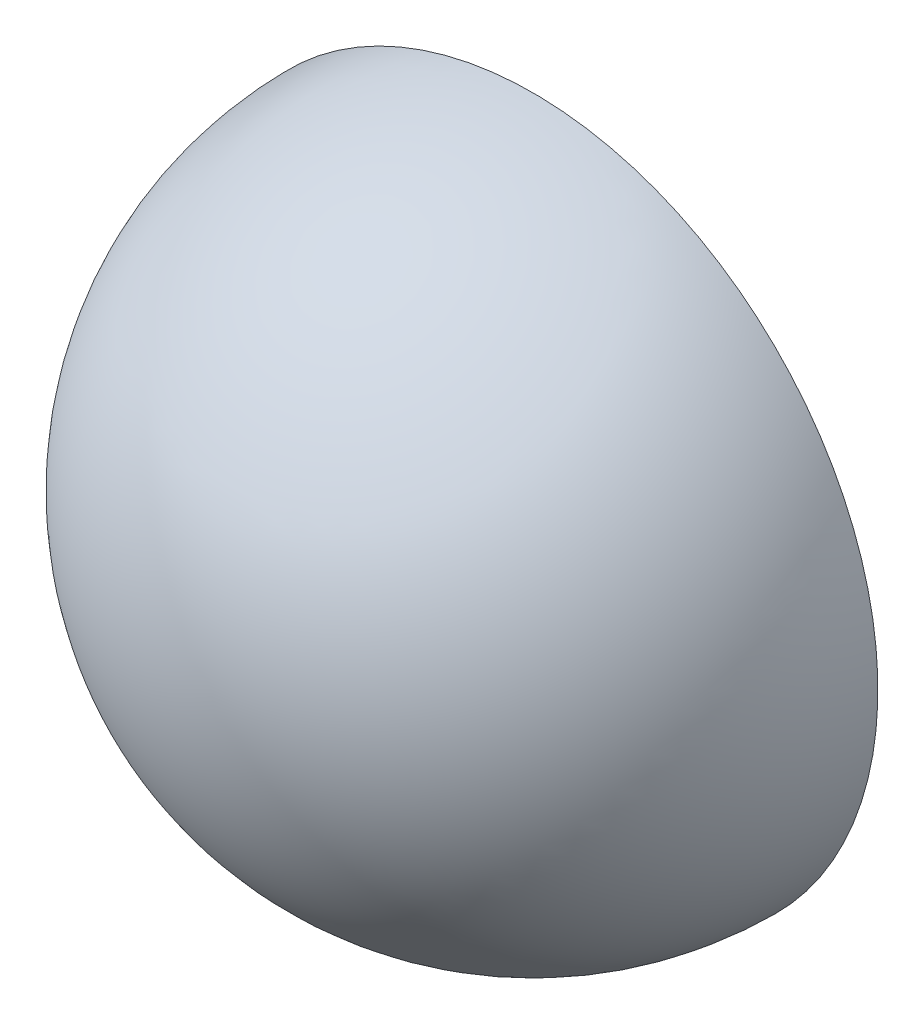
ISO-10303-21;
HEADER;
FILE_DESCRIPTION(('STEP AP214'),'2;1');
FILE_NAME('part.step','',(''),(''),'','','');
FILE_SCHEMA(('AUTOMOTIVE_DESIGN { 1 0 10303 214 1 1 1 1 }'));
ENDSEC;
DATA;
#1=APPLICATION_CONTEXT('core data for automotive mechanical design processes');
#2=APPLICATION_PROTOCOL_DEFINITION('international standard','automotive_design',2000,#1);
#3=PRODUCT_CONTEXT('',#1,'mechanical');
#4=PRODUCT('Part','Part','',(#3));
#5=PRODUCT_RELATED_PRODUCT_CATEGORY('part','',(#4));
#6=PRODUCT_DEFINITION_FORMATION('','',#4);
#7=PRODUCT_DEFINITION_CONTEXT('part definition',#1,'design');
#8=PRODUCT_DEFINITION('design','',#6,#7);
#9=PRODUCT_DEFINITION_SHAPE('','',#8);
#10=(LENGTH_UNIT() NAMED_UNIT(*) SI_UNIT(.MILLI.,.METRE.));
#11=(NAMED_UNIT(*) PLANE_ANGLE_UNIT() SI_UNIT($,.RADIAN.));
#12=(NAMED_UNIT(*) SI_UNIT($,.STERADIAN.) SOLID_ANGLE_UNIT());
#13=UNCERTAINTY_MEASURE_WITH_UNIT(LENGTH_MEASURE(1.E-05),#10,'distance_accuracy_value','');
#14=(GEOMETRIC_REPRESENTATION_CONTEXT(3) GLOBAL_UNCERTAINTY_ASSIGNED_CONTEXT((#13)) GLOBAL_UNIT_ASSIGNED_CONTEXT((#10,
#11,#12)) REPRESENTATION_CONTEXT('',''));
#15=CARTESIAN_POINT('',(0.,0.,0.));
#16=DIRECTION('',(0.,0.,1.));
#17=DIRECTION('',(1.,0.,0.));
#18=AXIS2_PLACEMENT_3D('',#15,#16,#17);
#19=CARTESIAN_POINT('',(0.,0.,0.));
#20=DIRECTION('',(0.,0.,-1.));
#21=DIRECTION('',(-1.,0.,0.));
#22=AXIS2_PLACEMENT_3D('',#19,#20,#21);
#23=PLANE('',#22);
#24=CARTESIAN_POINT('',(0.,0.,0.));
#25=DIRECTION('',(0.,0.,-1.));
#26=DIRECTION('',(-1.,0.,0.));
#27=AXIS2_PLACEMENT_3D('',#24,#25,#26);
#28=CIRCLE('',#27,2.);
#29=CARTESIAN_POINT('',(-2.,0.,0.));
#30=VERTEX_POINT('',#29);
#31=EDGE_CURVE('E10',#30,#30,#28,.T.);
#32=ORIENTED_EDGE('',*,*,#31,.T.);
#33=EDGE_LOOP('',(#32));
#34=FACE_BOUND('',#33,.T.);
#35=ADVANCED_FACE('F33',(#34),#23,.T.);
#36=CARTESIAN_POINT('',(0.,0.,0.));
#37=DIRECTION('',(0.,0.,-1.));
#38=DIRECTION('',(-1.,0.,0.));
#39=AXIS2_PLACEMENT_3D('',#36,#37,#38);
#40=SPHERICAL_SURFACE('',#39,2.);
#41=ORIENTED_EDGE('',*,*,#31,.F.);
#42=EDGE_LOOP('',(#41));
#43=FACE_BOUND('',#42,.T.);
#44=ADVANCED_FACE('F41',(#43),#40,.T.);
#45=CLOSED_SHELL('',(#35,#44));
#46=MANIFOLD_SOLID_BREP('B2',#45);
#47=ADVANCED_BREP_SHAPE_REPRESENTATION('',(#18,#46),#14);
#48=SHAPE_DEFINITION_REPRESENTATION(#9,#47);
ENDSEC;
END-ISO-10303-21;
